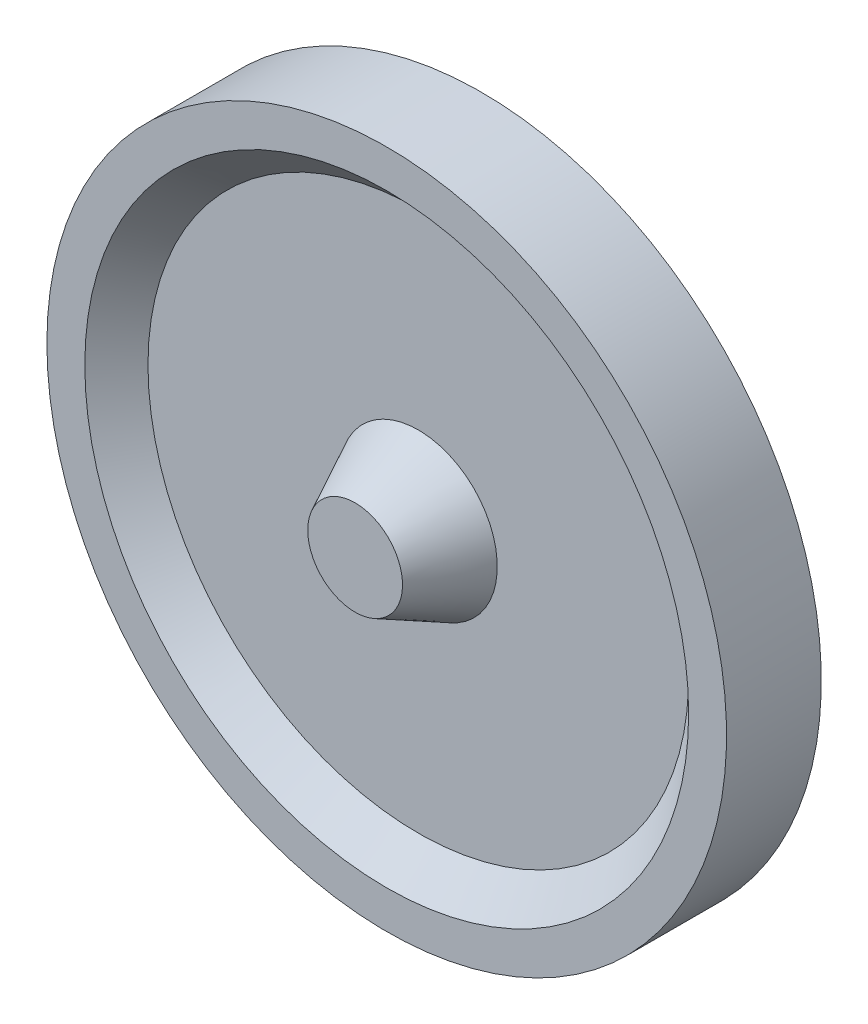
ISO-10303-21;
HEADER;
FILE_DESCRIPTION(('STEP AP214'),'2;1');
FILE_NAME('part.step','',(''),(''),'','','');
FILE_SCHEMA(('AUTOMOTIVE_DESIGN { 1 0 10303 214 1 1 1 1 }'));
ENDSEC;
DATA;
#1=APPLICATION_CONTEXT('core data for automotive mechanical design processes');
#2=APPLICATION_PROTOCOL_DEFINITION('international standard','automotive_design',2000,#1);
#3=PRODUCT_CONTEXT('',#1,'mechanical');
#4=PRODUCT('Part','Part','',(#3));
#5=PRODUCT_RELATED_PRODUCT_CATEGORY('part','',(#4));
#6=PRODUCT_DEFINITION_FORMATION('','',#4);
#7=PRODUCT_DEFINITION_CONTEXT('part definition',#1,'design');
#8=PRODUCT_DEFINITION('design','',#6,#7);
#9=PRODUCT_DEFINITION_SHAPE('','',#8);
#10=(LENGTH_UNIT() NAMED_UNIT(*) SI_UNIT(.MILLI.,.METRE.));
#11=(NAMED_UNIT(*) PLANE_ANGLE_UNIT() SI_UNIT($,.RADIAN.));
#12=(NAMED_UNIT(*) SI_UNIT($,.STERADIAN.) SOLID_ANGLE_UNIT());
#13=UNCERTAINTY_MEASURE_WITH_UNIT(LENGTH_MEASURE(1.E-05),#10,'distance_accuracy_value','');
#14=(GEOMETRIC_REPRESENTATION_CONTEXT(3) GLOBAL_UNCERTAINTY_ASSIGNED_CONTEXT((#13)) GLOBAL_UNIT_ASSIGNED_CONTEXT((#10,
#11,#12)) REPRESENTATION_CONTEXT('',''));
#15=CARTESIAN_POINT('',(0.,0.,0.));
#16=DIRECTION('',(0.,0.,1.));
#17=DIRECTION('',(1.,0.,0.));
#18=AXIS2_PLACEMENT_3D('',#15,#16,#17);
#19=CARTESIAN_POINT('',(19.1198097465169,0.,3.));
#20=DIRECTION('',(0.,0.,-1.));
#21=DIRECTION('',(-1.,0.,0.));
#22=AXIS2_PLACEMENT_3D('',#19,#20,#21);
#23=PLANE('',#22);
#24=CARTESIAN_POINT('',(0.,0.,3.));
#25=DIRECTION('',(0.,0.,-1.));
#26=DIRECTION('',(-1.,0.,0.));
#27=AXIS2_PLACEMENT_3D('',#24,#25,#26);
#28=CIRCLE('',#27,21.5210612545766);
#29=CARTESIAN_POINT('',(-21.5210612545766,0.,3.));
#30=VERTEX_POINT('',#29);
#31=EDGE_CURVE('E65',#30,#30,#28,.T.);
#32=ORIENTED_EDGE('',*,*,#31,.F.);
#33=EDGE_LOOP('',(#32));
#34=FACE_BOUND('',#33,.T.);
#35=CARTESIAN_POINT('',(0.,0.,3.));
#36=DIRECTION('',(0.,0.,-1.));
#37=DIRECTION('',(-1.,0.,0.));
#38=AXIS2_PLACEMENT_3D('',#35,#36,#37);
#39=CIRCLE('',#38,19.1198097465169);
#40=CARTESIAN_POINT('',(-19.1198097465169,0.,3.));
#41=VERTEX_POINT('',#40);
#42=EDGE_CURVE('E10',#41,#41,#39,.T.);
#43=ORIENTED_EDGE('',*,*,#42,.T.);
#44=EDGE_LOOP('',(#43));
#45=FACE_BOUND('',#44,.T.);
#46=ADVANCED_FACE('F31',(#34,#45),#23,.F.);
#47=CARTESIAN_POINT('',(0.,0.,0.999999999999999));
#48=DIRECTION('',(0.,0.,1.));
#49=DIRECTION('',(1.,0.,0.));
#50=AXIS2_PLACEMENT_3D('',#47,#48,#49);
#51=CONICAL_SURFACE('',#50,17.1198097465169,0.785398163397448);
#52=ORIENTED_EDGE('',*,*,#42,.F.);
#53=EDGE_LOOP('',(#52));
#54=FACE_BOUND('',#53,.T.);
#55=CARTESIAN_POINT('',(0.,0.,0.999999999999999));
#56=DIRECTION('',(0.,0.,-1.));
#57=DIRECTION('',(-1.,0.,0.));
#58=AXIS2_PLACEMENT_3D('',#55,#56,#57);
#59=CIRCLE('',#58,17.1198097465169);
#60=CARTESIAN_POINT('',(-17.1198097465169,0.,0.999999999999999));
#61=VERTEX_POINT('',#60);
#62=EDGE_CURVE('E37',#61,#61,#59,.T.);
#63=ORIENTED_EDGE('',*,*,#62,.T.);
#64=EDGE_LOOP('',(#63));
#65=FACE_BOUND('',#64,.T.);
#66=ADVANCED_FACE('F72',(#54,#65),#51,.F.);
#67=CARTESIAN_POINT('',(5.,0.,0.999999999999999));
#68=DIRECTION('',(0.,0.,-1.));
#69=DIRECTION('',(-1.,0.,0.));
#70=AXIS2_PLACEMENT_3D('',#67,#68,#69);
#71=PLANE('',#70);
#72=ORIENTED_EDGE('',*,*,#62,.F.);
#73=EDGE_LOOP('',(#72));
#74=FACE_BOUND('',#73,.T.);
#75=CARTESIAN_POINT('',(0.,0.,0.999999999999999));
#76=DIRECTION('',(0.,0.,-1.));
#77=DIRECTION('',(-1.,0.,0.));
#78=AXIS2_PLACEMENT_3D('',#75,#76,#77);
#79=CIRCLE('',#78,5.);
#80=CARTESIAN_POINT('',(-5.,0.,0.999999999999999));
#81=VERTEX_POINT('',#80);
#82=EDGE_CURVE('E41',#81,#81,#79,.T.);
#83=ORIENTED_EDGE('',*,*,#82,.T.);
#84=EDGE_LOOP('',(#83));
#85=FACE_BOUND('',#84,.T.);
#86=ADVANCED_FACE('F76',(#74,#85),#71,.F.);
#87=CARTESIAN_POINT('',(0.,0.,5.));
#88=DIRECTION('',(0.,0.,-1.));
#89=DIRECTION('',(-1.,0.,0.));
#90=AXIS2_PLACEMENT_3D('',#87,#88,#89);
#91=CONICAL_SURFACE('',#90,3.,0.463647609000806);
#92=ORIENTED_EDGE('',*,*,#82,.F.);
#93=EDGE_LOOP('',(#92));
#94=FACE_BOUND('',#93,.T.);
#95=CARTESIAN_POINT('',(0.,0.,5.));
#96=DIRECTION('',(0.,0.,-1.));
#97=DIRECTION('',(-1.,0.,0.));
#98=AXIS2_PLACEMENT_3D('',#95,#96,#97);
#99=CIRCLE('',#98,3.);
#100=CARTESIAN_POINT('',(-3.,0.,5.));
#101=VERTEX_POINT('',#100);
#102=EDGE_CURVE('E45',#101,#101,#99,.T.);
#103=ORIENTED_EDGE('',*,*,#102,.T.);
#104=EDGE_LOOP('',(#103));
#105=FACE_BOUND('',#104,.T.);
#106=ADVANCED_FACE('F81',(#94,#105),#91,.T.);
#107=CARTESIAN_POINT('',(0.,0.,5.));
#108=DIRECTION('',(0.,0.,-1.));
#109=DIRECTION('',(-1.,0.,0.));
#110=AXIS2_PLACEMENT_3D('',#107,#108,#109);
#111=PLANE('',#110);
#112=ORIENTED_EDGE('',*,*,#102,.F.);
#113=EDGE_LOOP('',(#112));
#114=FACE_BOUND('',#113,.T.);
#115=ADVANCED_FACE('F87',(#114),#111,.F.);
#116=CARTESIAN_POINT('',(0.,0.,-5.));
#117=DIRECTION('',(0.,0.,1.));
#118=DIRECTION('',(1.,0.,0.));
#119=AXIS2_PLACEMENT_3D('',#116,#117,#118);
#120=PLANE('',#119);
#121=CARTESIAN_POINT('',(0.,0.,-5.));
#122=DIRECTION('',(0.,0.,-1.));
#123=DIRECTION('',(-1.,0.,0.));
#124=AXIS2_PLACEMENT_3D('',#121,#122,#123);
#125=CIRCLE('',#124,3.);
#126=CARTESIAN_POINT('',(-3.,0.,-5.));
#127=VERTEX_POINT('',#126);
#128=EDGE_CURVE('E50',#127,#127,#125,.T.);
#129=ORIENTED_EDGE('',*,*,#128,.T.);
#130=EDGE_LOOP('',(#129));
#131=FACE_BOUND('',#130,.T.);
#132=ADVANCED_FACE('F91',(#131),#120,.F.);
#133=CARTESIAN_POINT('',(0.,0.,-1.));
#134=DIRECTION('',(0.,0.,1.));
#135=DIRECTION('',(1.,0.,0.));
#136=AXIS2_PLACEMENT_3D('',#133,#134,#135);
#137=CONICAL_SURFACE('',#136,5.,0.463647609000806);
#138=ORIENTED_EDGE('',*,*,#128,.F.);
#139=EDGE_LOOP('',(#138));
#140=FACE_BOUND('',#139,.T.);
#141=CARTESIAN_POINT('',(0.,0.,-1.));
#142=DIRECTION('',(0.,0.,-1.));
#143=DIRECTION('',(-1.,0.,0.));
#144=AXIS2_PLACEMENT_3D('',#141,#142,#143);
#145=CIRCLE('',#144,5.);
#146=CARTESIAN_POINT('',(-5.,0.,-1.));
#147=VERTEX_POINT('',#146);
#148=EDGE_CURVE('E53',#147,#147,#145,.T.);
#149=ORIENTED_EDGE('',*,*,#148,.T.);
#150=EDGE_LOOP('',(#149));
#151=FACE_BOUND('',#150,.T.);
#152=ADVANCED_FACE('F95',(#140,#151),#137,.T.);
#153=CARTESIAN_POINT('',(5.,0.,-1.));
#154=DIRECTION('',(0.,0.,1.));
#155=DIRECTION('',(1.,0.,0.));
#156=AXIS2_PLACEMENT_3D('',#153,#154,#155);
#157=PLANE('',#156);
#158=ORIENTED_EDGE('',*,*,#148,.F.);
#159=EDGE_LOOP('',(#158));
#160=FACE_BOUND('',#159,.T.);
#161=CARTESIAN_POINT('',(0.,0.,-1.));
#162=DIRECTION('',(0.,0.,-1.));
#163=DIRECTION('',(-1.,0.,0.));
#164=AXIS2_PLACEMENT_3D('',#161,#162,#163);
#165=CIRCLE('',#164,17.1198097465169);
#166=CARTESIAN_POINT('',(-17.1198097465169,0.,-1.));
#167=VERTEX_POINT('',#166);
#168=EDGE_CURVE('E56',#167,#167,#165,.T.);
#169=ORIENTED_EDGE('',*,*,#168,.T.);
#170=EDGE_LOOP('',(#169));
#171=FACE_BOUND('',#170,.T.);
#172=ADVANCED_FACE('F99',(#160,#171),#157,.F.);
#173=CARTESIAN_POINT('',(0.,0.,-3.));
#174=DIRECTION('',(0.,0.,-1.));
#175=DIRECTION('',(-1.,0.,0.));
#176=AXIS2_PLACEMENT_3D('',#173,#174,#175);
#177=CONICAL_SURFACE('',#176,19.1198097465169,0.785398163397448);
#178=ORIENTED_EDGE('',*,*,#168,.F.);
#179=EDGE_LOOP('',(#178));
#180=FACE_BOUND('',#179,.T.);
#181=CARTESIAN_POINT('',(0.,0.,-3.));
#182=DIRECTION('',(0.,0.,-1.));
#183=DIRECTION('',(-1.,0.,0.));
#184=AXIS2_PLACEMENT_3D('',#181,#182,#183);
#185=CIRCLE('',#184,19.1198097465169);
#186=CARTESIAN_POINT('',(-19.1198097465169,0.,-3.));
#187=VERTEX_POINT('',#186);
#188=EDGE_CURVE('E59',#187,#187,#185,.T.);
#189=ORIENTED_EDGE('',*,*,#188,.T.);
#190=EDGE_LOOP('',(#189));
#191=FACE_BOUND('',#190,.T.);
#192=ADVANCED_FACE('F103',(#180,#191),#177,.F.);
#193=CARTESIAN_POINT('',(19.1198097465169,0.,-3.));
#194=DIRECTION('',(0.,0.,1.));
#195=DIRECTION('',(1.,0.,0.));
#196=AXIS2_PLACEMENT_3D('',#193,#194,#195);
#197=PLANE('',#196);
#198=ORIENTED_EDGE('',*,*,#188,.F.);
#199=EDGE_LOOP('',(#198));
#200=FACE_BOUND('',#199,.T.);
#201=CARTESIAN_POINT('',(0.,0.,-3.));
#202=DIRECTION('',(0.,0.,-1.));
#203=DIRECTION('',(-1.,0.,0.));
#204=AXIS2_PLACEMENT_3D('',#201,#202,#203);
#205=CIRCLE('',#204,21.5210612545766);
#206=CARTESIAN_POINT('',(-21.5210612545766,0.,-3.));
#207=VERTEX_POINT('',#206);
#208=EDGE_CURVE('E62',#207,#207,#205,.T.);
#209=ORIENTED_EDGE('',*,*,#208,.T.);
#210=EDGE_LOOP('',(#209));
#211=FACE_BOUND('',#210,.T.);
#212=ADVANCED_FACE('F107',(#200,#211),#197,.F.);
#213=CARTESIAN_POINT('',(0.,0.,-9.99277586744972));
#214=DIRECTION('',(0.,0.,-1.));
#215=DIRECTION('',(-1.,0.,0.));
#216=AXIS2_PLACEMENT_3D('',#213,#214,#215);
#217=CYLINDRICAL_SURFACE('',#216,21.5210612545766);
#218=ORIENTED_EDGE('',*,*,#208,.F.);
#219=EDGE_LOOP('',(#218));
#220=FACE_BOUND('',#219,.T.);
#221=ORIENTED_EDGE('',*,*,#31,.T.);
#222=EDGE_LOOP('',(#221));
#223=FACE_BOUND('',#222,.T.);
#224=ADVANCED_FACE('F69',(#220,#223),#217,.T.);
#225=CLOSED_SHELL('',(#46,#66,#86,#106,#115,#132,#152,#172,#192,#212,#224));
#226=MANIFOLD_SOLID_BREP('B2',#225);
#227=ADVANCED_BREP_SHAPE_REPRESENTATION('',(#18,#226),#14);
#228=SHAPE_DEFINITION_REPRESENTATION(#9,#227);
ENDSEC;
END-ISO-10303-21;
